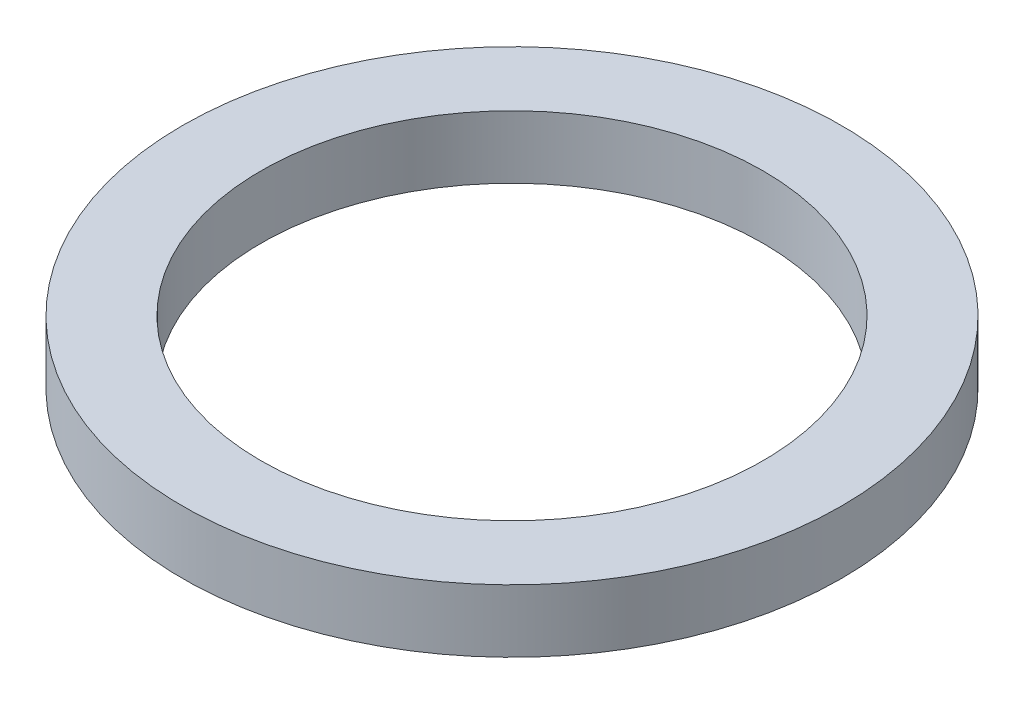
ISO-10303-21;
HEADER;
FILE_DESCRIPTION(('STEP AP214'),'2;1');
FILE_NAME('part.step','',(''),(''),'','','');
FILE_SCHEMA(('AUTOMOTIVE_DESIGN { 1 0 10303 214 1 1 1 1 }'));
ENDSEC;
DATA;
#1=APPLICATION_CONTEXT('core data for automotive mechanical design processes');
#2=APPLICATION_PROTOCOL_DEFINITION('international standard','automotive_design',2000,#1);
#3=PRODUCT_CONTEXT('',#1,'mechanical');
#4=PRODUCT('Part','Part','',(#3));
#5=PRODUCT_RELATED_PRODUCT_CATEGORY('part','',(#4));
#6=PRODUCT_DEFINITION_FORMATION('','',#4);
#7=PRODUCT_DEFINITION_CONTEXT('part definition',#1,'design');
#8=PRODUCT_DEFINITION('design','',#6,#7);
#9=PRODUCT_DEFINITION_SHAPE('','',#8);
#10=(LENGTH_UNIT() NAMED_UNIT(*) SI_UNIT(.MILLI.,.METRE.));
#11=(NAMED_UNIT(*) PLANE_ANGLE_UNIT() SI_UNIT($,.RADIAN.));
#12=(NAMED_UNIT(*) SI_UNIT($,.STERADIAN.) SOLID_ANGLE_UNIT());
#13=UNCERTAINTY_MEASURE_WITH_UNIT(LENGTH_MEASURE(1.E-05),#10,'distance_accuracy_value','');
#14=(GEOMETRIC_REPRESENTATION_CONTEXT(3) GLOBAL_UNCERTAINTY_ASSIGNED_CONTEXT((#13)) GLOBAL_UNIT_ASSIGNED_CONTEXT((#10,
#11,#12)) REPRESENTATION_CONTEXT('',''));
#15=CARTESIAN_POINT('',(0.,0.,0.));
#16=DIRECTION('',(0.,0.,1.));
#17=DIRECTION('',(1.,0.,0.));
#18=AXIS2_PLACEMENT_3D('',#15,#16,#17);
#19=CARTESIAN_POINT('',(0.,1.,0.));
#20=DIRECTION('',(0.,1.,0.));
#21=DIRECTION('',(0.,0.,1.));
#22=AXIS2_PLACEMENT_3D('',#19,#20,#21);
#23=PLANE('',#22);
#24=CARTESIAN_POINT('',(0.,1.,0.));
#25=DIRECTION('',(0.,1.,0.));
#26=DIRECTION('',(1.,0.,0.));
#27=AXIS2_PLACEMENT_3D('',#24,#25,#26);
#28=CIRCLE('',#27,5.25);
#29=CARTESIAN_POINT('',(5.25,1.,0.));
#30=VERTEX_POINT('',#29);
#31=EDGE_CURVE('E11',#30,#30,#28,.T.);
#32=ORIENTED_EDGE('',*,*,#31,.T.);
#33=EDGE_LOOP('',(#32));
#34=FACE_BOUND('',#33,.T.);
#35=CARTESIAN_POINT('',(0.,1.,0.));
#36=DIRECTION('',(0.,1.,0.));
#37=DIRECTION('',(0.,0.,1.));
#38=AXIS2_PLACEMENT_3D('',#35,#36,#37);
#39=CIRCLE('',#38,4.);
#40=CARTESIAN_POINT('',(0.,1.,4.));
#41=VERTEX_POINT('',#40);
#42=EDGE_CURVE('E53',#41,#41,#39,.T.);
#43=ORIENTED_EDGE('',*,*,#42,.F.);
#44=EDGE_LOOP('',(#43));
#45=FACE_BOUND('',#44,.T.);
#46=ADVANCED_FACE('F42',(#34,#45),#23,.T.);
#47=CARTESIAN_POINT('',(0.,0.,0.));
#48=DIRECTION('',(0.,1.,0.));
#49=DIRECTION('',(0.,0.,1.));
#50=AXIS2_PLACEMENT_3D('',#47,#48,#49);
#51=PLANE('',#50);
#52=CARTESIAN_POINT('',(0.,0.,0.));
#53=DIRECTION('',(0.,1.,0.));
#54=DIRECTION('',(1.,0.,0.));
#55=AXIS2_PLACEMENT_3D('',#52,#53,#54);
#56=CIRCLE('',#55,5.25);
#57=CARTESIAN_POINT('',(5.25,0.,0.));
#58=VERTEX_POINT('',#57);
#59=EDGE_CURVE('E46',#58,#58,#56,.T.);
#60=ORIENTED_EDGE('',*,*,#59,.F.);
#61=EDGE_LOOP('',(#60));
#62=FACE_BOUND('',#61,.T.);
#63=CARTESIAN_POINT('',(0.,0.,0.));
#64=DIRECTION('',(0.,1.,0.));
#65=DIRECTION('',(0.,0.,1.));
#66=AXIS2_PLACEMENT_3D('',#63,#64,#65);
#67=CIRCLE('',#66,4.);
#68=CARTESIAN_POINT('',(0.,0.,4.));
#69=VERTEX_POINT('',#68);
#70=EDGE_CURVE('E55',#69,#69,#67,.T.);
#71=ORIENTED_EDGE('',*,*,#70,.T.);
#72=EDGE_LOOP('',(#71));
#73=FACE_BOUND('',#72,.T.);
#74=ADVANCED_FACE('F65',(#62,#73),#51,.F.);
#75=CARTESIAN_POINT('',(0.,1.,0.));
#76=DIRECTION('',(0.,-1.,0.));
#77=DIRECTION('',(0.,0.,-1.));
#78=AXIS2_PLACEMENT_3D('',#75,#76,#77);
#79=CYLINDRICAL_SURFACE('',#78,5.25);
#80=ORIENTED_EDGE('',*,*,#31,.F.);
#81=EDGE_LOOP('',(#80));
#82=FACE_BOUND('',#81,.T.);
#83=ORIENTED_EDGE('',*,*,#59,.T.);
#84=EDGE_LOOP('',(#83));
#85=FACE_BOUND('',#84,.T.);
#86=ADVANCED_FACE('F44',(#82,#85),#79,.T.);
#87=CARTESIAN_POINT('',(0.,1.,0.));
#88=DIRECTION('',(0.,-1.,0.));
#89=DIRECTION('',(0.,0.,-1.));
#90=AXIS2_PLACEMENT_3D('',#87,#88,#89);
#91=CYLINDRICAL_SURFACE('',#90,4.);
#92=ORIENTED_EDGE('',*,*,#42,.T.);
#93=EDGE_LOOP('',(#92));
#94=FACE_BOUND('',#93,.T.);
#95=ORIENTED_EDGE('',*,*,#70,.F.);
#96=EDGE_LOOP('',(#95));
#97=FACE_BOUND('',#96,.T.);
#98=ADVANCED_FACE('F61',(#94,#97),#91,.F.);
#99=CLOSED_SHELL('',(#46,#74,#86,#98));
#100=MANIFOLD_SOLID_BREP('B2',#99);
#101=ADVANCED_BREP_SHAPE_REPRESENTATION('',(#18,#100),#14);
#102=SHAPE_DEFINITION_REPRESENTATION(#9,#101);
ENDSEC;
END-ISO-10303-21;
